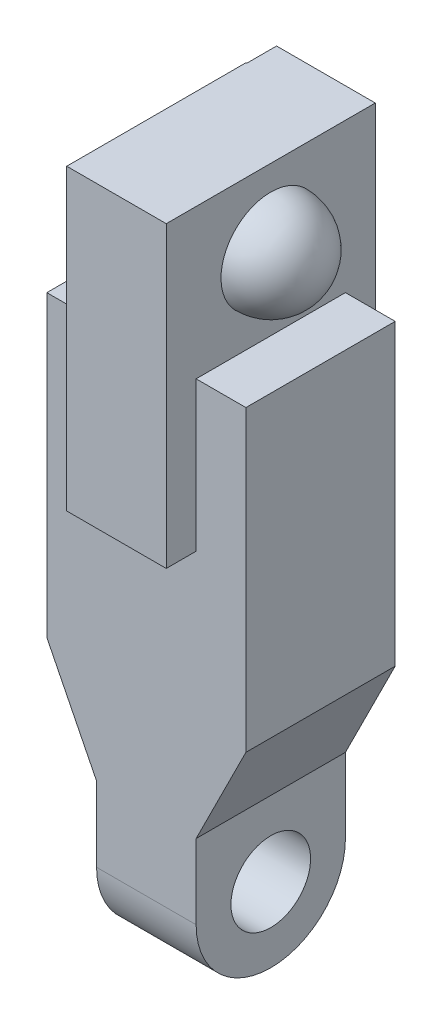
ISO-10303-21;
HEADER;
FILE_DESCRIPTION(('STEP AP214'),'2;1');
FILE_NAME('part.step','',(''),(''),'','','');
FILE_SCHEMA(('AUTOMOTIVE_DESIGN { 1 0 10303 214 1 1 1 1 }'));
ENDSEC;
DATA;
#1=APPLICATION_CONTEXT('core data for automotive mechanical design processes');
#2=APPLICATION_PROTOCOL_DEFINITION('international standard','automotive_design',2000,#1);
#3=PRODUCT_CONTEXT('',#1,'mechanical');
#4=PRODUCT('Part','Part','',(#3));
#5=PRODUCT_RELATED_PRODUCT_CATEGORY('part','',(#4));
#6=PRODUCT_DEFINITION_FORMATION('','',#4);
#7=PRODUCT_DEFINITION_CONTEXT('part definition',#1,'design');
#8=PRODUCT_DEFINITION('design','',#6,#7);
#9=PRODUCT_DEFINITION_SHAPE('','',#8);
#10=(LENGTH_UNIT() NAMED_UNIT(*) SI_UNIT(.MILLI.,.METRE.));
#11=(NAMED_UNIT(*) PLANE_ANGLE_UNIT() SI_UNIT($,.RADIAN.));
#12=(NAMED_UNIT(*) SI_UNIT($,.STERADIAN.) SOLID_ANGLE_UNIT());
#13=UNCERTAINTY_MEASURE_WITH_UNIT(LENGTH_MEASURE(1.E-05),#10,'distance_accuracy_value','');
#14=(GEOMETRIC_REPRESENTATION_CONTEXT(3) GLOBAL_UNCERTAINTY_ASSIGNED_CONTEXT((#13)) GLOBAL_UNIT_ASSIGNED_CONTEXT((#10,
#11,#12)) REPRESENTATION_CONTEXT('',''));
#15=CARTESIAN_POINT('',(0.,0.,0.));
#16=DIRECTION('',(0.,0.,1.));
#17=DIRECTION('',(1.,0.,0.));
#18=AXIS2_PLACEMENT_3D('',#15,#16,#17);
#19=CARTESIAN_POINT('',(0.,0.,15.));
#20=DIRECTION('',(0.,0.,-1.));
#21=DIRECTION('',(-1.,0.,0.));
#22=AXIS2_PLACEMENT_3D('',#19,#20,#21);
#23=PLANE('',#22);
#24=DIRECTION('',(0.,1.,0.));
#25=VECTOR('',#24,1.);
#26=CARTESIAN_POINT('',(-4.87804878048779,-63.9227642276423,15.));
#27=LINE('',#26,#25);
#28=CARTESIAN_POINT('',(-4.87804878048779,-56.4227642276423,15.));
#29=VERTEX_POINT('',#28);
#30=CARTESIAN_POINT('',(-4.87804878048779,-48.9227642276423,15.));
#31=VERTEX_POINT('',#30);
#32=EDGE_CURVE('E232',#29,#31,#27,.T.);
#33=ORIENTED_EDGE('',*,*,#32,.F.);
#34=DIRECTION('',(-1.,0.,0.));
#35=VECTOR('',#34,1.);
#36=CARTESIAN_POINT('',(5.12195121951221,-56.4227642276423,15.));
#37=LINE('',#36,#35);
#38=CARTESIAN_POINT('',(5.12195121951221,-56.4227642276423,15.));
#39=VERTEX_POINT('',#38);
#40=EDGE_CURVE('E106',#29,#39,#37,.F.);
#41=ORIENTED_EDGE('',*,*,#40,.T.);
#42=DIRECTION('',(0.,1.,0.));
#43=VECTOR('',#42,1.);
#44=CARTESIAN_POINT('',(5.12195121951221,-63.9227642276423,15.));
#45=LINE('',#44,#43);
#46=CARTESIAN_POINT('',(5.12195121951221,-48.9227642276423,15.));
#47=VERTEX_POINT('',#46);
#48=EDGE_CURVE('E223',#39,#47,#45,.T.);
#49=ORIENTED_EDGE('',*,*,#48,.T.);
#50=DIRECTION('',(0.447213595499958,0.894427190999916,0.));
#51=VECTOR('',#50,1.);
#52=CARTESIAN_POINT('',(23.6666666666667,-11.8333333333333,15.));
#53=LINE('',#52,#51);
#54=CARTESIAN_POINT('',(10.1219512195122,-38.9227642276423,15.));
#55=VERTEX_POINT('',#54);
#56=EDGE_CURVE('E226',#47,#55,#53,.T.);
#57=ORIENTED_EDGE('',*,*,#56,.T.);
#58=DIRECTION('',(0.,-1.,0.));
#59=VECTOR('',#58,1.);
#60=CARTESIAN_POINT('',(10.1219512195122,0.,15.));
#61=LINE('',#60,#59);
#62=CARTESIAN_POINT('',(10.1219512195122,-8.92276422764228,15.));
#63=VERTEX_POINT('',#62);
#64=EDGE_CURVE('E243',#63,#55,#61,.T.);
#65=ORIENTED_EDGE('',*,*,#64,.F.);
#66=DIRECTION('',(1.,0.,0.));
#67=VECTOR('',#66,1.);
#68=CARTESIAN_POINT('',(0.,-8.92276422764227,15.));
#69=LINE('',#68,#67);
#70=CARTESIAN_POINT('',(5.1219512195122,-8.92276422764228,15.));
#71=VERTEX_POINT('',#70);
#72=EDGE_CURVE('E395',#71,#63,#69,.T.);
#73=ORIENTED_EDGE('',*,*,#72,.F.);
#74=DIRECTION('',(0.,1.,0.));
#75=VECTOR('',#74,1.);
#76=CARTESIAN_POINT('',(5.1219512195122,6.07723577235772,15.));
#77=LINE('',#76,#75);
#78=CARTESIAN_POINT('',(5.12195121951221,-23.9227642276423,15.));
#79=VERTEX_POINT('',#78);
#80=EDGE_CURVE('E365',#79,#71,#77,.T.);
#81=ORIENTED_EDGE('',*,*,#80,.F.);
#82=DIRECTION('',(1.,0.,0.));
#83=VECTOR('',#82,1.);
#84=CARTESIAN_POINT('',(-4.8780487804878,-23.9227642276423,15.));
#85=LINE('',#84,#83);
#86=CARTESIAN_POINT('',(-4.8780487804878,-23.9227642276423,15.));
#87=VERTEX_POINT('',#86);
#88=EDGE_CURVE('E360',#87,#79,#85,.T.);
#89=ORIENTED_EDGE('',*,*,#88,.F.);
#90=DIRECTION('',(0.,-1.,0.));
#91=VECTOR('',#90,1.);
#92=CARTESIAN_POINT('',(-4.8780487804878,6.07723577235772,15.));
#93=LINE('',#92,#91);
#94=CARTESIAN_POINT('',(-4.8780487804878,-8.92276422764228,15.));
#95=VERTEX_POINT('',#94);
#96=EDGE_CURVE('E265',#95,#87,#93,.T.);
#97=ORIENTED_EDGE('',*,*,#96,.F.);
#98=DIRECTION('',(1.,0.,0.));
#99=VECTOR('',#98,1.);
#100=CARTESIAN_POINT('',(0.,-8.92276422764228,15.));
#101=LINE('',#100,#99);
#102=CARTESIAN_POINT('',(-9.8780487804878,-8.92276422764228,15.));
#103=VERTEX_POINT('',#102);
#104=EDGE_CURVE('E397',#103,#95,#101,.T.);
#105=ORIENTED_EDGE('',*,*,#104,.F.);
#106=DIRECTION('',(0.,-1.,0.));
#107=VECTOR('',#106,1.);
#108=CARTESIAN_POINT('',(-9.8780487804878,0.,15.));
#109=LINE('',#108,#107);
#110=CARTESIAN_POINT('',(-9.87804878048779,-38.9227642276423,15.));
#111=VERTEX_POINT('',#110);
#112=EDGE_CURVE('E400',#103,#111,#109,.T.);
#113=ORIENTED_EDGE('',*,*,#112,.T.);
#114=DIRECTION('',(-0.447213595499958,0.894427190999916,0.));
#115=VECTOR('',#114,1.);
#116=CARTESIAN_POINT('',(-23.4715447154471,-11.7357723577236,15.));
#117=LINE('',#116,#115);
#118=EDGE_CURVE('E386',#31,#111,#117,.T.);
#119=ORIENTED_EDGE('',*,*,#118,.F.);
#120=EDGE_LOOP('',(#33,#41,#49,#57,#65,#73,#81,#89,#97,#105,#113,#119));
#121=FACE_BOUND('',#120,.T.);
#122=ADVANCED_FACE('F98',(#121),#23,.F.);
#123=CARTESIAN_POINT('',(5.1219512195122,6.07723577235772,15.));
#124=DIRECTION('',(1.,0.,0.));
#125=DIRECTION('',(0.,1.,0.));
#126=AXIS2_PLACEMENT_3D('',#123,#124,#125);
#127=PLANE('',#126);
#128=CARTESIAN_POINT('',(5.1219512195122,-1.42276422764228,7.5));
#129=DIRECTION('',(1.,0.,0.));
#130=DIRECTION('',(0.,1.,0.));
#131=AXIS2_PLACEMENT_3D('',#128,#129,#130);
#132=CIRCLE('',#131,5.);
#133=CARTESIAN_POINT('',(5.1219512195122,3.57723577235772,7.5));
#134=VERTEX_POINT('',#133);
#135=EDGE_CURVE('E12',#134,#134,#132,.T.);
#136=ORIENTED_EDGE('',*,*,#135,.F.);
#137=EDGE_LOOP('',(#136));
#138=FACE_BOUND('',#137,.T.);
#139=DIRECTION('',(0.,0.,-1.));
#140=VECTOR('',#139,1.);
#141=CARTESIAN_POINT('',(5.1219512195122,6.07723577235772,15.));
#142=LINE('',#141,#140);
#143=CARTESIAN_POINT('',(5.1219512195122,6.07723577235772,18.));
#144=VERTEX_POINT('',#143);
#145=CARTESIAN_POINT('',(5.1219512195122,6.07723577235772,-3.));
#146=VERTEX_POINT('',#145);
#147=EDGE_CURVE('E263',#144,#146,#142,.T.);
#148=ORIENTED_EDGE('',*,*,#147,.F.);
#149=DIRECTION('',(0.,1.,0.));
#150=VECTOR('',#149,1.);
#151=CARTESIAN_POINT('',(5.1219512195122,6.07723577235772,18.));
#152=LINE('',#151,#150);
#153=CARTESIAN_POINT('',(5.12195121951221,-23.9227642276423,18.));
#154=VERTEX_POINT('',#153);
#155=EDGE_CURVE('E367',#154,#144,#152,.T.);
#156=ORIENTED_EDGE('',*,*,#155,.F.);
#157=DIRECTION('',(0.,0.,-1.));
#158=VECTOR('',#157,1.);
#159=CARTESIAN_POINT('',(5.12195121951221,-23.9227642276423,18.));
#160=LINE('',#159,#158);
#161=EDGE_CURVE('E372',#154,#79,#160,.T.);
#162=ORIENTED_EDGE('',*,*,#161,.T.);
#163=ORIENTED_EDGE('',*,*,#80,.T.);
#164=DIRECTION('',(0.,0.,1.));
#165=VECTOR('',#164,1.);
#166=CARTESIAN_POINT('',(5.1219512195122,-8.92276422764228,0.));
#167=LINE('',#166,#165);
#168=CARTESIAN_POINT('',(5.1219512195122,-8.92276422764228,0.));
#169=VERTEX_POINT('',#168);
#170=EDGE_CURVE('E414',#169,#71,#167,.T.);
#171=ORIENTED_EDGE('',*,*,#170,.F.);
#172=DIRECTION('',(0.,-1.,0.));
#173=VECTOR('',#172,1.);
#174=CARTESIAN_POINT('',(5.1219512195122,6.07723577235772,0.));
#175=LINE('',#174,#173);
#176=CARTESIAN_POINT('',(5.12195121951219,-23.9227642276423,0.));
#177=VERTEX_POINT('',#176);
#178=EDGE_CURVE('E273',#169,#177,#175,.T.);
#179=ORIENTED_EDGE('',*,*,#178,.T.);
#180=DIRECTION('',(0.,0.,1.));
#181=VECTOR('',#180,1.);
#182=CARTESIAN_POINT('',(5.12195121951219,-23.9227642276423,-3.));
#183=LINE('',#182,#181);
#184=CARTESIAN_POINT('',(5.12195121951219,-23.9227642276423,-3.));
#185=VERTEX_POINT('',#184);
#186=EDGE_CURVE('E357',#185,#177,#183,.T.);
#187=ORIENTED_EDGE('',*,*,#186,.F.);
#188=DIRECTION('',(0.,-1.,0.));
#189=VECTOR('',#188,1.);
#190=CARTESIAN_POINT('',(5.1219512195122,6.07723577235772,-3.));
#191=LINE('',#190,#189);
#192=EDGE_CURVE('E344',#146,#185,#191,.T.);
#193=ORIENTED_EDGE('',*,*,#192,.F.);
#194=EDGE_LOOP('',(#148,#156,#162,#163,#171,#179,#187,#193));
#195=FACE_BOUND('',#194,.T.);
#196=ADVANCED_FACE('F305',(#138,#195),#127,.T.);
#197=CARTESIAN_POINT('',(-4.8780487804878,6.07723577235772,15.));
#198=DIRECTION('',(1.,0.,0.));
#199=DIRECTION('',(0.,1.,0.));
#200=AXIS2_PLACEMENT_3D('',#197,#198,#199);
#201=PLANE('',#200);
#202=CARTESIAN_POINT('',(-4.8780487804878,-1.42276422764228,7.5));
#203=DIRECTION('',(1.,0.,0.));
#204=DIRECTION('',(0.,1.,0.));
#205=AXIS2_PLACEMENT_3D('',#202,#203,#204);
#206=CIRCLE('',#205,5.);
#207=CARTESIAN_POINT('',(-4.8780487804878,3.57723577235772,7.5));
#208=VERTEX_POINT('',#207);
#209=EDGE_CURVE('E284',#208,#208,#206,.T.);
#210=ORIENTED_EDGE('',*,*,#209,.T.);
#211=EDGE_LOOP('',(#210));
#212=FACE_BOUND('',#211,.T.);
#213=DIRECTION('',(0.,0.,1.));
#214=VECTOR('',#213,1.);
#215=CARTESIAN_POINT('',(-4.8780487804878,-8.92276422764228,0.));
#216=LINE('',#215,#214);
#217=CARTESIAN_POINT('',(-4.8780487804878,-8.92276422764228,0.));
#218=VERTEX_POINT('',#217);
#219=EDGE_CURVE('E411',#218,#95,#216,.T.);
#220=ORIENTED_EDGE('',*,*,#219,.T.);
#221=ORIENTED_EDGE('',*,*,#96,.T.);
#222=DIRECTION('',(0.,0.,-1.));
#223=VECTOR('',#222,1.);
#224=CARTESIAN_POINT('',(-4.8780487804878,-23.9227642276423,18.));
#225=LINE('',#224,#223);
#226=CARTESIAN_POINT('',(-4.8780487804878,-23.9227642276423,18.));
#227=VERTEX_POINT('',#226);
#228=EDGE_CURVE('E244',#227,#87,#225,.T.);
#229=ORIENTED_EDGE('',*,*,#228,.F.);
#230=DIRECTION('',(0.,-1.,0.));
#231=VECTOR('',#230,1.);
#232=CARTESIAN_POINT('',(-4.8780487804878,6.07723577235772,18.));
#233=LINE('',#232,#231);
#234=CARTESIAN_POINT('',(-4.8780487804878,6.07723577235772,18.));
#235=VERTEX_POINT('',#234);
#236=EDGE_CURVE('E361',#235,#227,#233,.T.);
#237=ORIENTED_EDGE('',*,*,#236,.F.);
#238=DIRECTION('',(0.,0.,-1.));
#239=VECTOR('',#238,1.);
#240=CARTESIAN_POINT('',(-4.8780487804878,6.07723577235772,15.));
#241=LINE('',#240,#239);
#242=CARTESIAN_POINT('',(-4.8780487804878,6.07723577235772,0.));
#243=VERTEX_POINT('',#242);
#244=EDGE_CURVE('E261',#235,#243,#241,.T.);
#245=ORIENTED_EDGE('',*,*,#244,.T.);
#246=DIRECTION('',(0.,-1.,0.));
#247=VECTOR('',#246,1.);
#248=CARTESIAN_POINT('',(-4.8780487804878,6.07723577235772,0.));
#249=LINE('',#248,#247);
#250=EDGE_CURVE('E258',#243,#218,#249,.T.);
#251=ORIENTED_EDGE('',*,*,#250,.T.);
#252=EDGE_LOOP('',(#220,#221,#229,#237,#245,#251));
#253=FACE_BOUND('',#252,.T.);
#254=ADVANCED_FACE('F288',(#212,#253),#201,.F.);
#255=CARTESIAN_POINT('',(-4.8780487804878,6.07723577235772,15.));
#256=DIRECTION('',(0.,1.,0.));
#257=DIRECTION('',(0.,0.,1.));
#258=AXIS2_PLACEMENT_3D('',#255,#256,#257);
#259=PLANE('',#258);
#260=DIRECTION('',(1.,0.,0.));
#261=VECTOR('',#260,1.);
#262=CARTESIAN_POINT('',(-4.8780487804878,6.07723577235772,0.));
#263=LINE('',#262,#261);
#264=CARTESIAN_POINT('',(-4.79478340682779,6.07723577235772,0.));
#265=VERTEX_POINT('',#264);
#266=EDGE_CURVE('E256',#243,#265,#263,.T.);
#267=ORIENTED_EDGE('',*,*,#266,.F.);
#268=ORIENTED_EDGE('',*,*,#244,.F.);
#269=DIRECTION('',(-1.,0.,0.));
#270=VECTOR('',#269,1.);
#271=CARTESIAN_POINT('',(-4.8780487804878,6.07723577235772,18.));
#272=LINE('',#271,#270);
#273=EDGE_CURVE('E370',#144,#235,#272,.T.);
#274=ORIENTED_EDGE('',*,*,#273,.F.);
#275=ORIENTED_EDGE('',*,*,#147,.T.);
#276=DIRECTION('',(1.,0.,0.));
#277=VECTOR('',#276,1.);
#278=CARTESIAN_POINT('',(5.1219512195122,6.07723577235772,-3.));
#279=LINE('',#278,#277);
#280=CARTESIAN_POINT('',(-4.79478340682779,6.07723577235772,-3.));
#281=VERTEX_POINT('',#280);
#282=EDGE_CURVE('E355',#281,#146,#279,.T.);
#283=ORIENTED_EDGE('',*,*,#282,.F.);
#284=DIRECTION('',(0.,0.,1.));
#285=VECTOR('',#284,1.);
#286=CARTESIAN_POINT('',(-4.79478340682779,6.07723577235772,-3.));
#287=LINE('',#286,#285);
#288=EDGE_CURVE('E332',#281,#265,#287,.T.);
#289=ORIENTED_EDGE('',*,*,#288,.T.);
#290=EDGE_LOOP('',(#267,#268,#274,#275,#283,#289));
#291=FACE_BOUND('',#290,.T.);
#292=ADVANCED_FACE('F318',(#291),#259,.T.);
#293=CARTESIAN_POINT('',(0.,0.,0.));
#294=DIRECTION('',(0.,0.,-1.));
#295=DIRECTION('',(-1.,0.,0.));
#296=AXIS2_PLACEMENT_3D('',#293,#294,#295);
#297=PLANE('',#296);
#298=DIRECTION('',(0.,1.,0.));
#299=VECTOR('',#298,1.);
#300=CARTESIAN_POINT('',(5.12195121951221,-63.9227642276423,0.));
#301=LINE('',#300,#299);
#302=CARTESIAN_POINT('',(5.12195121951221,-56.4227642276423,0.));
#303=VERTEX_POINT('',#302);
#304=CARTESIAN_POINT('',(5.12195121951221,-48.9227642276423,0.));
#305=VERTEX_POINT('',#304);
#306=EDGE_CURVE('E231',#303,#305,#301,.T.);
#307=ORIENTED_EDGE('',*,*,#306,.F.);
#308=DIRECTION('',(1.,0.,0.));
#309=VECTOR('',#308,1.);
#310=CARTESIAN_POINT('',(0.,-56.4227642276423,0.));
#311=LINE('',#310,#309);
#312=CARTESIAN_POINT('',(-4.87804878048779,-56.4227642276423,0.));
#313=VERTEX_POINT('',#312);
#314=EDGE_CURVE('E275',#303,#313,#311,.F.);
#315=ORIENTED_EDGE('',*,*,#314,.T.);
#316=DIRECTION('',(0.,1.,0.));
#317=VECTOR('',#316,1.);
#318=CARTESIAN_POINT('',(-4.87804878048779,-63.9227642276423,0.));
#319=LINE('',#318,#317);
#320=CARTESIAN_POINT('',(-4.87804878048779,-48.9227642276423,0.));
#321=VERTEX_POINT('',#320);
#322=EDGE_CURVE('E350',#313,#321,#319,.T.);
#323=ORIENTED_EDGE('',*,*,#322,.T.);
#324=DIRECTION('',(-0.447213595499958,0.894427190999916,0.));
#325=VECTOR('',#324,1.);
#326=CARTESIAN_POINT('',(-23.4715447154471,-11.7357723577236,0.));
#327=LINE('',#326,#325);
#328=CARTESIAN_POINT('',(-9.87804878048779,-38.9227642276423,0.));
#329=VERTEX_POINT('',#328);
#330=EDGE_CURVE('E248',#321,#329,#327,.T.);
#331=ORIENTED_EDGE('',*,*,#330,.T.);
#332=DIRECTION('',(0.,-1.,0.));
#333=VECTOR('',#332,1.);
#334=CARTESIAN_POINT('',(-9.8780487804878,0.,0.));
#335=LINE('',#334,#333);
#336=CARTESIAN_POINT('',(-9.8780487804878,-8.92276422764228,0.));
#337=VERTEX_POINT('',#336);
#338=EDGE_CURVE('E252',#337,#329,#335,.T.);
#339=ORIENTED_EDGE('',*,*,#338,.F.);
#340=DIRECTION('',(1.,0.,0.));
#341=VECTOR('',#340,1.);
#342=CARTESIAN_POINT('',(0.,-8.92276422764228,0.));
#343=LINE('',#342,#341);
#344=EDGE_CURVE('E390',#337,#218,#343,.T.);
#345=ORIENTED_EDGE('',*,*,#344,.T.);
#346=ORIENTED_EDGE('',*,*,#250,.F.);
#347=ORIENTED_EDGE('',*,*,#266,.T.);
#348=DIRECTION('',(0.,1.,0.));
#349=VECTOR('',#348,1.);
#350=CARTESIAN_POINT('',(-4.79478340682779,6.07723577235772,0.));
#351=LINE('',#350,#349);
#352=CARTESIAN_POINT('',(-4.79478340682779,-23.9227642276423,0.));
#353=VERTEX_POINT('',#352);
#354=EDGE_CURVE('E335',#353,#265,#351,.T.);
#355=ORIENTED_EDGE('',*,*,#354,.F.);
#356=DIRECTION('',(-1.,0.,0.));
#357=VECTOR('',#356,1.);
#358=CARTESIAN_POINT('',(5.12195121951219,-23.9227642276423,0.));
#359=LINE('',#358,#357);
#360=EDGE_CURVE('E345',#177,#353,#359,.T.);
#361=ORIENTED_EDGE('',*,*,#360,.F.);
#362=ORIENTED_EDGE('',*,*,#178,.F.);
#363=DIRECTION('',(1.,0.,0.));
#364=VECTOR('',#363,1.);
#365=CARTESIAN_POINT('',(0.,-8.92276422764227,0.));
#366=LINE('',#365,#364);
#367=CARTESIAN_POINT('',(10.1219512195122,-8.92276422764228,0.));
#368=VERTEX_POINT('',#367);
#369=EDGE_CURVE('E388',#169,#368,#366,.T.);
#370=ORIENTED_EDGE('',*,*,#369,.T.);
#371=DIRECTION('',(0.,-1.,0.));
#372=VECTOR('',#371,1.);
#373=CARTESIAN_POINT('',(10.1219512195122,0.,0.));
#374=LINE('',#373,#372);
#375=CARTESIAN_POINT('',(10.1219512195122,-38.9227642276423,0.));
#376=VERTEX_POINT('',#375);
#377=EDGE_CURVE('E385',#368,#376,#374,.T.);
#378=ORIENTED_EDGE('',*,*,#377,.T.);
#379=DIRECTION('',(0.447213595499958,0.894427190999916,0.));
#380=VECTOR('',#379,1.);
#381=CARTESIAN_POINT('',(23.6666666666667,-11.8333333333333,0.));
#382=LINE('',#381,#380);
#383=EDGE_CURVE('E383',#305,#376,#382,.T.);
#384=ORIENTED_EDGE('',*,*,#383,.F.);
#385=EDGE_LOOP('',(#307,#315,#323,#331,#339,#345,#346,#347,#355,#361,#362,#370,#378,#384));
#386=FACE_BOUND('',#385,.T.);
#387=ADVANCED_FACE('F315',(#386),#297,.T.);
#388=CARTESIAN_POINT('',(23.6666666666667,-11.8333333333333,0.));
#389=DIRECTION('',(0.894427190999916,-0.447213595499958,0.));
#390=DIRECTION('',(0.447213595499958,0.894427190999916,0.));
#391=AXIS2_PLACEMENT_3D('',#388,#389,#390);
#392=PLANE('',#391);
#393=ORIENTED_EDGE('',*,*,#56,.F.);
#394=DIRECTION('',(0.,0.,1.));
#395=VECTOR('',#394,1.);
#396=CARTESIAN_POINT('',(5.12195121951221,-48.9227642276423,0.));
#397=LINE('',#396,#395);
#398=EDGE_CURVE('E238',#305,#47,#397,.T.);
#399=ORIENTED_EDGE('',*,*,#398,.F.);
#400=ORIENTED_EDGE('',*,*,#383,.T.);
#401=DIRECTION('',(0.,0.,1.));
#402=VECTOR('',#401,1.);
#403=CARTESIAN_POINT('',(10.1219512195122,-38.9227642276423,0.));
#404=LINE('',#403,#402);
#405=EDGE_CURVE('E241',#376,#55,#404,.T.);
#406=ORIENTED_EDGE('',*,*,#405,.T.);
#407=EDGE_LOOP('',(#393,#399,#400,#406));
#408=FACE_BOUND('',#407,.T.);
#409=ADVANCED_FACE('F236',(#408),#392,.T.);
#410=CARTESIAN_POINT('',(10.1219512195122,0.,0.));
#411=DIRECTION('',(-1.,0.,0.));
#412=DIRECTION('',(0.,-1.,0.));
#413=AXIS2_PLACEMENT_3D('',#410,#411,#412);
#414=PLANE('',#413);
#415=ORIENTED_EDGE('',*,*,#64,.T.);
#416=ORIENTED_EDGE('',*,*,#405,.F.);
#417=ORIENTED_EDGE('',*,*,#377,.F.);
#418=DIRECTION('',(0.,0.,1.));
#419=VECTOR('',#418,1.);
#420=CARTESIAN_POINT('',(10.1219512195122,-8.92276422764228,0.));
#421=LINE('',#420,#419);
#422=EDGE_CURVE('E250',#368,#63,#421,.T.);
#423=ORIENTED_EDGE('',*,*,#422,.T.);
#424=EDGE_LOOP('',(#415,#416,#417,#423));
#425=FACE_BOUND('',#424,.T.);
#426=ADVANCED_FACE('F419',(#425),#414,.F.);
#427=CARTESIAN_POINT('',(0.,-8.92276422764227,0.));
#428=DIRECTION('',(0.,-1.,0.));
#429=DIRECTION('',(1.,0.,0.));
#430=AXIS2_PLACEMENT_3D('',#427,#428,#429);
#431=PLANE('',#430);
#432=ORIENTED_EDGE('',*,*,#72,.T.);
#433=ORIENTED_EDGE('',*,*,#422,.F.);
#434=ORIENTED_EDGE('',*,*,#369,.F.);
#435=ORIENTED_EDGE('',*,*,#170,.T.);
#436=EDGE_LOOP('',(#432,#433,#434,#435));
#437=FACE_BOUND('',#436,.T.);
#438=ADVANCED_FACE('F485',(#437),#431,.F.);
#439=CARTESIAN_POINT('',(0.,-8.92276422764228,0.));
#440=DIRECTION('',(0.,-1.,0.));
#441=DIRECTION('',(0.,0.,-1.));
#442=AXIS2_PLACEMENT_3D('',#439,#440,#441);
#443=PLANE('',#442);
#444=ORIENTED_EDGE('',*,*,#104,.T.);
#445=ORIENTED_EDGE('',*,*,#219,.F.);
#446=ORIENTED_EDGE('',*,*,#344,.F.);
#447=DIRECTION('',(0.,0.,1.));
#448=VECTOR('',#447,1.);
#449=CARTESIAN_POINT('',(-9.8780487804878,-8.92276422764228,0.));
#450=LINE('',#449,#448);
#451=EDGE_CURVE('E409',#337,#103,#450,.T.);
#452=ORIENTED_EDGE('',*,*,#451,.T.);
#453=EDGE_LOOP('',(#444,#445,#446,#452));
#454=FACE_BOUND('',#453,.T.);
#455=ADVANCED_FACE('F436',(#454),#443,.F.);
#456=CARTESIAN_POINT('',(-9.8780487804878,0.,0.));
#457=DIRECTION('',(-1.,0.,0.));
#458=DIRECTION('',(0.,-1.,0.));
#459=AXIS2_PLACEMENT_3D('',#456,#457,#458);
#460=PLANE('',#459);
#461=ORIENTED_EDGE('',*,*,#112,.F.);
#462=ORIENTED_EDGE('',*,*,#451,.F.);
#463=ORIENTED_EDGE('',*,*,#338,.T.);
#464=DIRECTION('',(0.,0.,1.));
#465=VECTOR('',#464,1.);
#466=CARTESIAN_POINT('',(-9.87804878048779,-38.9227642276423,0.));
#467=LINE('',#466,#465);
#468=EDGE_CURVE('E407',#329,#111,#467,.T.);
#469=ORIENTED_EDGE('',*,*,#468,.T.);
#470=EDGE_LOOP('',(#461,#462,#463,#469));
#471=FACE_BOUND('',#470,.T.);
#472=ADVANCED_FACE('F440',(#471),#460,.T.);
#473=CARTESIAN_POINT('',(-23.4715447154471,-11.7357723577236,0.));
#474=DIRECTION('',(0.894427190999916,0.447213595499958,0.));
#475=DIRECTION('',(-0.447213595499958,0.894427190999916,0.));
#476=AXIS2_PLACEMENT_3D('',#473,#474,#475);
#477=PLANE('',#476);
#478=ORIENTED_EDGE('',*,*,#118,.T.);
#479=ORIENTED_EDGE('',*,*,#468,.F.);
#480=ORIENTED_EDGE('',*,*,#330,.F.);
#481=DIRECTION('',(0.,0.,1.));
#482=VECTOR('',#481,1.);
#483=CARTESIAN_POINT('',(-4.87804878048779,-48.9227642276423,0.));
#484=LINE('',#483,#482);
#485=EDGE_CURVE('E259',#321,#31,#484,.T.);
#486=ORIENTED_EDGE('',*,*,#485,.T.);
#487=EDGE_LOOP('',(#478,#479,#480,#486));
#488=FACE_BOUND('',#487,.T.);
#489=ADVANCED_FACE('F445',(#488),#477,.F.);
#490=CARTESIAN_POINT('',(-4.8780487804878,-23.9227642276423,18.));
#491=DIRECTION('',(0.,1.,0.));
#492=DIRECTION('',(0.,0.,1.));
#493=AXIS2_PLACEMENT_3D('',#490,#491,#492);
#494=PLANE('',#493);
#495=ORIENTED_EDGE('',*,*,#88,.T.);
#496=ORIENTED_EDGE('',*,*,#161,.F.);
#497=DIRECTION('',(1.,0.,0.));
#498=VECTOR('',#497,1.);
#499=CARTESIAN_POINT('',(-4.8780487804878,-23.9227642276423,18.));
#500=LINE('',#499,#498);
#501=EDGE_CURVE('E364',#227,#154,#500,.T.);
#502=ORIENTED_EDGE('',*,*,#501,.F.);
#503=ORIENTED_EDGE('',*,*,#228,.T.);
#504=EDGE_LOOP('',(#495,#496,#502,#503));
#505=FACE_BOUND('',#504,.T.);
#506=ADVANCED_FACE('F429',(#505),#494,.F.);
#507=CARTESIAN_POINT('',(0.,0.,18.));
#508=DIRECTION('',(0.,0.,1.));
#509=DIRECTION('',(1.,0.,0.));
#510=AXIS2_PLACEMENT_3D('',#507,#508,#509);
#511=PLANE('',#510);
#512=ORIENTED_EDGE('',*,*,#236,.T.);
#513=ORIENTED_EDGE('',*,*,#501,.T.);
#514=ORIENTED_EDGE('',*,*,#155,.T.);
#515=ORIENTED_EDGE('',*,*,#273,.T.);
#516=EDGE_LOOP('',(#512,#513,#514,#515));
#517=FACE_BOUND('',#516,.T.);
#518=ADVANCED_FACE('F468',(#517),#511,.T.);
#519=CARTESIAN_POINT('',(5.12195121951219,-23.9227642276423,-3.));
#520=DIRECTION('',(0.,1.,0.));
#521=DIRECTION('',(0.,0.,1.));
#522=AXIS2_PLACEMENT_3D('',#519,#520,#521);
#523=PLANE('',#522);
#524=ORIENTED_EDGE('',*,*,#360,.T.);
#525=DIRECTION('',(0.,0.,1.));
#526=VECTOR('',#525,1.);
#527=CARTESIAN_POINT('',(-4.79478340682779,-23.9227642276423,-3.));
#528=LINE('',#527,#526);
#529=CARTESIAN_POINT('',(-4.79478340682779,-23.9227642276423,-3.));
#530=VERTEX_POINT('',#529);
#531=EDGE_CURVE('E343',#530,#353,#528,.T.);
#532=ORIENTED_EDGE('',*,*,#531,.F.);
#533=DIRECTION('',(-1.,0.,0.));
#534=VECTOR('',#533,1.);
#535=CARTESIAN_POINT('',(5.12195121951219,-23.9227642276423,-3.));
#536=LINE('',#535,#534);
#537=EDGE_CURVE('E348',#185,#530,#536,.T.);
#538=ORIENTED_EDGE('',*,*,#537,.F.);
#539=ORIENTED_EDGE('',*,*,#186,.T.);
#540=EDGE_LOOP('',(#524,#532,#538,#539));
#541=FACE_BOUND('',#540,.T.);
#542=ADVANCED_FACE('F464',(#541),#523,.F.);
#543=CARTESIAN_POINT('',(-4.79478340682779,6.07723577235772,-3.));
#544=DIRECTION('',(1.,0.,0.));
#545=DIRECTION('',(0.,0.,-1.));
#546=AXIS2_PLACEMENT_3D('',#543,#544,#545);
#547=PLANE('',#546);
#548=ORIENTED_EDGE('',*,*,#354,.T.);
#549=ORIENTED_EDGE('',*,*,#288,.F.);
#550=DIRECTION('',(0.,1.,0.));
#551=VECTOR('',#550,1.);
#552=CARTESIAN_POINT('',(-4.79478340682779,6.07723577235772,-3.));
#553=LINE('',#552,#551);
#554=EDGE_CURVE('E458',#530,#281,#553,.T.);
#555=ORIENTED_EDGE('',*,*,#554,.F.);
#556=ORIENTED_EDGE('',*,*,#531,.T.);
#557=EDGE_LOOP('',(#548,#549,#555,#556));
#558=FACE_BOUND('',#557,.T.);
#559=ADVANCED_FACE('F340',(#558),#547,.F.);
#560=CARTESIAN_POINT('',(0.,0.,-3.));
#561=DIRECTION('',(0.,0.,-1.));
#562=DIRECTION('',(-1.,0.,0.));
#563=AXIS2_PLACEMENT_3D('',#560,#561,#562);
#564=PLANE('',#563);
#565=ORIENTED_EDGE('',*,*,#192,.T.);
#566=ORIENTED_EDGE('',*,*,#537,.T.);
#567=ORIENTED_EDGE('',*,*,#554,.T.);
#568=ORIENTED_EDGE('',*,*,#282,.T.);
#569=EDGE_LOOP('',(#565,#566,#567,#568));
#570=FACE_BOUND('',#569,.T.);
#571=ADVANCED_FACE('F466',(#570),#564,.T.);
#572=CARTESIAN_POINT('',(-4.87804878048779,-63.9227642276423,15.));
#573=DIRECTION('',(1.,0.,0.));
#574=DIRECTION('',(0.,0.,-1.));
#575=AXIS2_PLACEMENT_3D('',#572,#573,#574);
#576=PLANE('',#575);
#577=CARTESIAN_POINT('',(-4.87804878048779,-56.4227642276423,7.5));
#578=DIRECTION('',(-1.,0.,0.));
#579=DIRECTION('',(0.,0.,1.));
#580=AXIS2_PLACEMENT_3D('',#577,#578,#579);
#581=CIRCLE('',#580,4.);
#582=CARTESIAN_POINT('',(-4.87804878048779,-56.4227642276423,11.5));
#583=VERTEX_POINT('',#582);
#584=EDGE_CURVE('E269',#583,#583,#581,.T.);
#585=ORIENTED_EDGE('',*,*,#584,.F.);
#586=EDGE_LOOP('',(#585));
#587=FACE_BOUND('',#586,.T.);
#588=ORIENTED_EDGE('',*,*,#322,.F.);
#589=CARTESIAN_POINT('',(-4.87804878048779,-56.4227642276423,7.5));
#590=DIRECTION('',(1.,0.,0.));
#591=DIRECTION('',(0.,0.,-1.));
#592=AXIS2_PLACEMENT_3D('',#589,#590,#591);
#593=CIRCLE('',#592,7.5);
#594=CARTESIAN_POINT('',(-4.87804878048779,-63.9227642276423,7.5));
#595=VERTEX_POINT('',#594);
#596=EDGE_CURVE('E279',#313,#595,#593,.F.);
#597=ORIENTED_EDGE('',*,*,#596,.T.);
#598=CARTESIAN_POINT('',(-4.87804878048779,-56.4227642276423,7.5));
#599=DIRECTION('',(1.,0.,0.));
#600=DIRECTION('',(0.,0.,-1.));
#601=AXIS2_PLACEMENT_3D('',#598,#599,#600);
#602=CIRCLE('',#601,7.5);
#603=EDGE_CURVE('E116',#595,#29,#602,.F.);
#604=ORIENTED_EDGE('',*,*,#603,.T.);
#605=ORIENTED_EDGE('',*,*,#32,.T.);
#606=ORIENTED_EDGE('',*,*,#485,.F.);
#607=EDGE_LOOP('',(#588,#597,#604,#605,#606));
#608=FACE_BOUND('',#607,.T.);
#609=ADVANCED_FACE('F454',(#587,#608),#576,.F.);
#610=CARTESIAN_POINT('',(5.12195121951221,-63.9227642276423,15.));
#611=DIRECTION('',(-1.,0.,0.));
#612=DIRECTION('',(0.,0.,1.));
#613=AXIS2_PLACEMENT_3D('',#610,#611,#612);
#614=PLANE('',#613);
#615=CARTESIAN_POINT('',(5.12195121951221,-56.4227642276423,7.5));
#616=DIRECTION('',(-1.,0.,0.));
#617=DIRECTION('',(0.,0.,1.));
#618=AXIS2_PLACEMENT_3D('',#615,#616,#617);
#619=CIRCLE('',#618,4.);
#620=CARTESIAN_POINT('',(5.12195121951221,-56.4227642276423,11.5));
#621=VERTEX_POINT('',#620);
#622=EDGE_CURVE('E266',#621,#621,#619,.T.);
#623=ORIENTED_EDGE('',*,*,#622,.T.);
#624=EDGE_LOOP('',(#623));
#625=FACE_BOUND('',#624,.T.);
#626=CARTESIAN_POINT('',(5.12195121951221,-56.4227642276423,7.5));
#627=DIRECTION('',(-1.,0.,0.));
#628=DIRECTION('',(0.,0.,1.));
#629=AXIS2_PLACEMENT_3D('',#626,#627,#628);
#630=CIRCLE('',#629,7.5);
#631=CARTESIAN_POINT('',(5.12195121951221,-63.9227642276423,7.5));
#632=VERTEX_POINT('',#631);
#633=EDGE_CURVE('E270',#39,#632,#630,.F.);
#634=ORIENTED_EDGE('',*,*,#633,.T.);
#635=CARTESIAN_POINT('',(5.12195121951221,-56.4227642276423,7.5));
#636=DIRECTION('',(-1.,0.,0.));
#637=DIRECTION('',(0.,0.,1.));
#638=AXIS2_PLACEMENT_3D('',#635,#636,#637);
#639=CIRCLE('',#638,7.5);
#640=EDGE_CURVE('E272',#632,#303,#639,.F.);
#641=ORIENTED_EDGE('',*,*,#640,.T.);
#642=ORIENTED_EDGE('',*,*,#306,.T.);
#643=ORIENTED_EDGE('',*,*,#398,.T.);
#644=ORIENTED_EDGE('',*,*,#48,.F.);
#645=EDGE_LOOP('',(#634,#641,#642,#643,#644));
#646=FACE_BOUND('',#645,.T.);
#647=ADVANCED_FACE('F246',(#625,#646),#614,.F.);
#648=CARTESIAN_POINT('',(10.1219512195122,-56.4227642276423,7.5));
#649=DIRECTION('',(-1.,0.,0.));
#650=DIRECTION('',(0.,0.,1.));
#651=AXIS2_PLACEMENT_3D('',#648,#649,#650);
#652=CYLINDRICAL_SURFACE('',#651,4.);
#653=ORIENTED_EDGE('',*,*,#584,.T.);
#654=EDGE_LOOP('',(#653));
#655=FACE_BOUND('',#654,.T.);
#656=ORIENTED_EDGE('',*,*,#622,.F.);
#657=EDGE_LOOP('',(#656));
#658=FACE_BOUND('',#657,.T.);
#659=ADVANCED_FACE('F522',(#655,#658),#652,.F.);
#660=CARTESIAN_POINT('',(0.,-56.4227642276423,7.5));
#661=DIRECTION('',(1.,0.,0.));
#662=DIRECTION('',(0.,0.,-1.));
#663=AXIS2_PLACEMENT_3D('',#660,#661,#662);
#664=CYLINDRICAL_SURFACE('',#663,7.5);
#665=ORIENTED_EDGE('',*,*,#40,.F.);
#666=ORIENTED_EDGE('',*,*,#603,.F.);
#667=DIRECTION('',(-1.,0.,0.));
#668=VECTOR('',#667,1.);
#669=CARTESIAN_POINT('',(-4.87804878048779,-63.9227642276423,7.5));
#670=LINE('',#669,#668);
#671=EDGE_CURVE('E282',#632,#595,#670,.T.);
#672=ORIENTED_EDGE('',*,*,#671,.F.);
#673=ORIENTED_EDGE('',*,*,#633,.F.);
#674=EDGE_LOOP('',(#665,#666,#672,#673));
#675=FACE_BOUND('',#674,.T.);
#676=ADVANCED_FACE('F100',(#675),#664,.T.);
#677=CARTESIAN_POINT('',(0.,-56.4227642276423,7.5));
#678=DIRECTION('',(1.,0.,0.));
#679=DIRECTION('',(0.,0.,-1.));
#680=AXIS2_PLACEMENT_3D('',#677,#678,#679);
#681=CYLINDRICAL_SURFACE('',#680,7.5);
#682=ORIENTED_EDGE('',*,*,#596,.F.);
#683=ORIENTED_EDGE('',*,*,#314,.F.);
#684=ORIENTED_EDGE('',*,*,#640,.F.);
#685=ORIENTED_EDGE('',*,*,#671,.T.);
#686=EDGE_LOOP('',(#682,#683,#684,#685));
#687=FACE_BOUND('',#686,.T.);
#688=ADVANCED_FACE('F294',(#687),#681,.T.);
#689=CARTESIAN_POINT('',(-4.8780487804878,-1.42276422764228,7.5));
#690=DIRECTION('',(0.,1.,0.));
#691=DIRECTION('',(0.,0.,1.));
#692=AXIS2_PLACEMENT_3D('',#689,#690,#691);
#693=SPHERICAL_SURFACE('',#692,5.);
#694=CARTESIAN_POINT('',(0.1219512195122,-1.42276422764228,7.5));
#695=VERTEX_POINT('',#694);
#696=VERTEX_LOOP('',#695);
#697=FACE_BOUND('',#696,.T.);
#698=ORIENTED_EDGE('',*,*,#209,.F.);
#699=EDGE_LOOP('',(#698));
#700=FACE_BOUND('',#699,.T.);
#701=ADVANCED_FACE('F291',(#697,#700),#693,.F.);
#702=CARTESIAN_POINT('',(5.1219512195122,-1.42276422764228,7.5));
#703=DIRECTION('',(0.,1.,0.));
#704=DIRECTION('',(0.,0.,-1.));
#705=AXIS2_PLACEMENT_3D('',#702,#703,#704);
#706=SPHERICAL_SURFACE('',#705,5.);
#707=CARTESIAN_POINT('',(5.1219512195122,-1.42276422764228,7.5));
#708=DIRECTION('',(1.,0.,0.));
#709=DIRECTION('',(0.,1.,0.));
#710=AXIS2_PLACEMENT_3D('',#707,#708,#709);
#711=SPHERICAL_SURFACE('',#710,5.);
#712=ORIENTED_EDGE('',*,*,#135,.T.);
#713=EDGE_LOOP('',(#712));
#714=FACE_BOUND('',#713,.T.);
#715=ADVANCED_FACE('F293',(#714),#711,.T.);
#716=CLOSED_SHELL('',(#122,#196,#254,#292,#387,#409,#426,#438,#455,#472,#489,#506,#518,#542,
#559,#571,#609,#647,#659,#676,#688,#701,#715));
#717=MANIFOLD_SOLID_BREP('B2',#716);
#718=ADVANCED_BREP_SHAPE_REPRESENTATION('',(#18,#717),#14);
#719=SHAPE_DEFINITION_REPRESENTATION(#9,#718);
ENDSEC;
END-ISO-10303-21;
